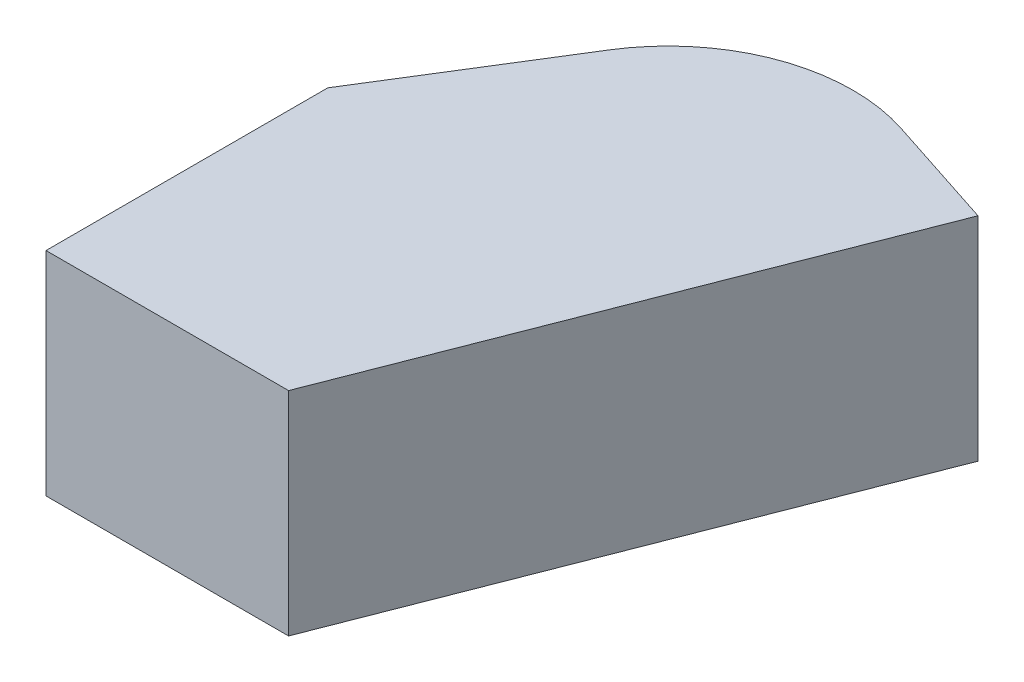
ISO-10303-21;
HEADER;
FILE_DESCRIPTION(('STEP AP214'),'2;1');
FILE_NAME('part.step','',(''),(''),'','','');
FILE_SCHEMA(('AUTOMOTIVE_DESIGN { 1 0 10303 214 1 1 1 1 }'));
ENDSEC;
DATA;
#1=APPLICATION_CONTEXT('core data for automotive mechanical design processes');
#2=APPLICATION_PROTOCOL_DEFINITION('international standard','automotive_design',2000,#1);
#3=PRODUCT_CONTEXT('',#1,'mechanical');
#4=PRODUCT('Part','Part','',(#3));
#5=PRODUCT_RELATED_PRODUCT_CATEGORY('part','',(#4));
#6=PRODUCT_DEFINITION_FORMATION('','',#4);
#7=PRODUCT_DEFINITION_CONTEXT('part definition',#1,'design');
#8=PRODUCT_DEFINITION('design','',#6,#7);
#9=PRODUCT_DEFINITION_SHAPE('','',#8);
#10=(LENGTH_UNIT() NAMED_UNIT(*) SI_UNIT(.MILLI.,.METRE.));
#11=(NAMED_UNIT(*) PLANE_ANGLE_UNIT() SI_UNIT($,.RADIAN.));
#12=(NAMED_UNIT(*) SI_UNIT($,.STERADIAN.) SOLID_ANGLE_UNIT());
#13=UNCERTAINTY_MEASURE_WITH_UNIT(LENGTH_MEASURE(1.E-05),#10,'distance_accuracy_value','');
#14=(GEOMETRIC_REPRESENTATION_CONTEXT(3) GLOBAL_UNCERTAINTY_ASSIGNED_CONTEXT((#13)) GLOBAL_UNIT_ASSIGNED_CONTEXT((#10,
#11,#12)) REPRESENTATION_CONTEXT('',''));
#15=CARTESIAN_POINT('',(0.,0.,0.));
#16=DIRECTION('',(0.,0.,1.));
#17=DIRECTION('',(1.,0.,0.));
#18=AXIS2_PLACEMENT_3D('',#15,#16,#17);
#19=CARTESIAN_POINT('',(-66.6737685117542,58.42,0.));
#20=DIRECTION('',(1.,0.,0.));
#21=DIRECTION('',(0.,0.,-1.));
#22=AXIS2_PLACEMENT_3D('',#19,#20,#21);
#23=PLANE('',#22);
#24=DIRECTION('',(0.,0.,1.));
#25=VECTOR('',#24,1.);
#26=CARTESIAN_POINT('',(-66.6737685117542,0.,0.));
#27=LINE('',#26,#25);
#28=CARTESIAN_POINT('',(-66.6737685117542,0.,0.));
#29=VERTEX_POINT('',#28);
#30=CARTESIAN_POINT('',(-66.6737685117542,0.,77.4518589102709));
#31=VERTEX_POINT('',#30);
#32=EDGE_CURVE('E117',#29,#31,#27,.T.);
#33=ORIENTED_EDGE('',*,*,#32,.T.);
#34=DIRECTION('',(0.,-1.,0.));
#35=VECTOR('',#34,1.);
#36=CARTESIAN_POINT('',(-66.6737685117542,58.42,77.4518589102709));
#37=LINE('',#36,#35);
#38=CARTESIAN_POINT('',(-66.6737685117542,58.42,77.4518589102709));
#39=VERTEX_POINT('',#38);
#40=EDGE_CURVE('E11',#39,#31,#37,.T.);
#41=ORIENTED_EDGE('',*,*,#40,.F.);
#42=DIRECTION('',(0.,0.,1.));
#43=VECTOR('',#42,1.);
#44=CARTESIAN_POINT('',(-66.6737685117542,58.42,0.));
#45=LINE('',#44,#43);
#46=CARTESIAN_POINT('',(-66.6737685117542,58.42,0.));
#47=VERTEX_POINT('',#46);
#48=EDGE_CURVE('E127',#47,#39,#45,.T.);
#49=ORIENTED_EDGE('',*,*,#48,.F.);
#50=DIRECTION('',(0.,-1.,0.));
#51=VECTOR('',#50,1.);
#52=CARTESIAN_POINT('',(-66.6737685117542,58.42,0.));
#53=LINE('',#52,#51);
#54=EDGE_CURVE('E113',#47,#29,#53,.T.);
#55=ORIENTED_EDGE('',*,*,#54,.T.);
#56=EDGE_LOOP('',(#33,#41,#49,#55));
#57=FACE_BOUND('',#56,.T.);
#58=ADVANCED_FACE('F33',(#57),#23,.F.);
#59=CARTESIAN_POINT('',(0.,58.42,77.4518589102709));
#60=DIRECTION('',(0.,0.,-1.));
#61=DIRECTION('',(-1.,0.,0.));
#62=AXIS2_PLACEMENT_3D('',#59,#60,#61);
#63=PLANE('',#62);
#64=DIRECTION('',(1.,0.,0.));
#65=VECTOR('',#64,1.);
#66=CARTESIAN_POINT('',(0.,0.,77.4518589102709));
#67=LINE('',#66,#65);
#68=CARTESIAN_POINT('',(0.,0.,77.4518589102709));
#69=VERTEX_POINT('',#68);
#70=EDGE_CURVE('E120',#31,#69,#67,.T.);
#71=ORIENTED_EDGE('',*,*,#70,.T.);
#72=DIRECTION('',(0.,-1.,0.));
#73=VECTOR('',#72,1.);
#74=CARTESIAN_POINT('',(0.,58.42,77.4518589102709));
#75=LINE('',#74,#73);
#76=CARTESIAN_POINT('',(0.,58.42,77.4518589102709));
#77=VERTEX_POINT('',#76);
#78=EDGE_CURVE('E41',#77,#69,#75,.T.);
#79=ORIENTED_EDGE('',*,*,#78,.F.);
#80=DIRECTION('',(1.,0.,0.));
#81=VECTOR('',#80,1.);
#82=CARTESIAN_POINT('',(0.,58.42,77.4518589102709));
#83=LINE('',#82,#81);
#84=EDGE_CURVE('E86',#39,#77,#83,.T.);
#85=ORIENTED_EDGE('',*,*,#84,.F.);
#86=ORIENTED_EDGE('',*,*,#40,.T.);
#87=EDGE_LOOP('',(#71,#79,#85,#86));
#88=FACE_BOUND('',#87,.T.);
#89=ADVANCED_FACE('F151',(#88),#63,.F.);
#90=CARTESIAN_POINT('',(53.1384921973379,58.42,-58.9035172942189));
#91=DIRECTION('',(-0.93174729177176,0.,-0.363107400469877));
#92=DIRECTION('',(-0.363107400469877,0.,0.93174729177176));
#93=AXIS2_PLACEMENT_3D('',#90,#91,#92);
#94=PLANE('',#93);
#95=DIRECTION('',(0.363107400469877,0.,-0.93174729177176));
#96=VECTOR('',#95,1.);
#97=CARTESIAN_POINT('',(53.1384921973379,0.,-58.9035172942189));
#98=LINE('',#97,#96);
#99=CARTESIAN_POINT('',(53.1384921973379,0.,-58.9035172942189));
#100=VERTEX_POINT('',#99);
#101=EDGE_CURVE('E122',#69,#100,#98,.T.);
#102=ORIENTED_EDGE('',*,*,#101,.T.);
#103=DIRECTION('',(0.,-1.,0.));
#104=VECTOR('',#103,1.);
#105=CARTESIAN_POINT('',(53.1384921973379,58.42,-58.9035172942189));
#106=LINE('',#105,#104);
#107=CARTESIAN_POINT('',(53.1384921973379,58.42,-58.9035172942189));
#108=VERTEX_POINT('',#107);
#109=EDGE_CURVE('E108',#108,#100,#106,.T.);
#110=ORIENTED_EDGE('',*,*,#109,.F.);
#111=DIRECTION('',(0.363107400469877,0.,-0.93174729177176));
#112=VECTOR('',#111,1.);
#113=CARTESIAN_POINT('',(53.1384921973379,58.42,-58.9035172942189));
#114=LINE('',#113,#112);
#115=EDGE_CURVE('E99',#77,#108,#114,.T.);
#116=ORIENTED_EDGE('',*,*,#115,.F.);
#117=ORIENTED_EDGE('',*,*,#78,.T.);
#118=EDGE_LOOP('',(#102,#110,#116,#117));
#119=FACE_BOUND('',#118,.T.);
#120=ADVANCED_FACE('F133',(#119),#94,.F.);
#121=CARTESIAN_POINT('',(21.8265277700403,58.42,-69.1139404770334));
#122=DIRECTION('',(-0.310020599830917,0.,0.950729839481479));
#123=DIRECTION('',(0.950729839481479,0.,0.310020599830917));
#124=AXIS2_PLACEMENT_3D('',#121,#122,#123);
#125=PLANE('',#124);
#126=DIRECTION('',(-0.950729839481479,0.,-0.310020599830917));
#127=VECTOR('',#126,1.);
#128=CARTESIAN_POINT('',(21.8265277700403,0.,-69.1139404770334));
#129=LINE('',#128,#127);
#130=CARTESIAN_POINT('',(21.8265277700403,0.,-69.1139404770334));
#131=VERTEX_POINT('',#130);
#132=EDGE_CURVE('E107',#100,#131,#129,.T.);
#133=ORIENTED_EDGE('',*,*,#132,.T.);
#134=DIRECTION('',(0.,-1.,0.));
#135=VECTOR('',#134,1.);
#136=CARTESIAN_POINT('',(21.8265277700403,58.42,-69.1139404770334));
#137=LINE('',#136,#135);
#138=CARTESIAN_POINT('',(21.8265277700403,58.42,-69.1139404770334));
#139=VERTEX_POINT('',#138);
#140=EDGE_CURVE('E104',#139,#131,#137,.T.);
#141=ORIENTED_EDGE('',*,*,#140,.F.);
#142=DIRECTION('',(-0.950729839481479,0.,-0.310020599830917));
#143=VECTOR('',#142,1.);
#144=CARTESIAN_POINT('',(21.8265277700403,58.42,-69.1139404770334));
#145=LINE('',#144,#143);
#146=EDGE_CURVE('E93',#108,#139,#145,.T.);
#147=ORIENTED_EDGE('',*,*,#146,.F.);
#148=ORIENTED_EDGE('',*,*,#109,.T.);
#149=EDGE_LOOP('',(#133,#141,#147,#148));
#150=FACE_BOUND('',#149,.T.);
#151=ADVANCED_FACE('F105',(#150),#125,.F.);
#152=CARTESIAN_POINT('',(6.07748129862949,58.42,-20.8168646313743));
#153=DIRECTION('',(0.,-1.,0.));
#154=DIRECTION('',(0.,0.,-1.));
#155=AXIS2_PLACEMENT_3D('',#152,#153,#154);
#156=CYLINDRICAL_SURFACE('',#155,50.8);
#157=CARTESIAN_POINT('',(6.07748129862949,0.,-20.8168646313743));
#158=DIRECTION('',(0.,1.,0.));
#159=DIRECTION('',(0.,0.,-1.));
#160=AXIS2_PLACEMENT_3D('',#157,#158,#159);
#161=CIRCLE('',#160,50.8);
#162=CARTESIAN_POINT('',(-37.0678218733656,0.,-47.6333299875063));
#163=VERTEX_POINT('',#162);
#164=EDGE_CURVE('E72',#131,#163,#161,.T.);
#165=ORIENTED_EDGE('',*,*,#164,.T.);
#166=DIRECTION('',(0.,-1.,0.));
#167=VECTOR('',#166,1.);
#168=CARTESIAN_POINT('',(-37.0678218733656,58.42,-47.6333299875063));
#169=LINE('',#168,#167);
#170=CARTESIAN_POINT('',(-37.0678218733656,58.42,-47.6333299875063));
#171=VERTEX_POINT('',#170);
#172=EDGE_CURVE('E109',#171,#163,#169,.T.);
#173=ORIENTED_EDGE('',*,*,#172,.F.);
#174=CARTESIAN_POINT('',(6.07748129862949,58.42,-20.8168646313743));
#175=DIRECTION('',(0.,1.,0.));
#176=DIRECTION('',(0.,0.,-1.));
#177=AXIS2_PLACEMENT_3D('',#174,#175,#176);
#178=CIRCLE('',#177,50.8);
#179=EDGE_CURVE('E97',#139,#171,#178,.T.);
#180=ORIENTED_EDGE('',*,*,#179,.F.);
#181=ORIENTED_EDGE('',*,*,#140,.T.);
#182=EDGE_LOOP('',(#165,#173,#180,#181));
#183=FACE_BOUND('',#182,.T.);
#184=ADVANCED_FACE('F111',(#183),#156,.T.);
#185=CARTESIAN_POINT('',(-66.6737685117542,58.42,0.));
#186=DIRECTION('',(0.849316991574704,0.,0.527883176301816));
#187=DIRECTION('',(0.527883176301816,0.,-0.849316991574704));
#188=AXIS2_PLACEMENT_3D('',#185,#186,#187);
#189=PLANE('',#188);
#190=DIRECTION('',(-0.527883176301816,0.,0.849316991574704));
#191=VECTOR('',#190,1.);
#192=CARTESIAN_POINT('',(-66.6737685117542,0.,0.));
#193=LINE('',#192,#191);
#194=EDGE_CURVE('E78',#163,#29,#193,.T.);
#195=ORIENTED_EDGE('',*,*,#194,.T.);
#196=ORIENTED_EDGE('',*,*,#54,.F.);
#197=DIRECTION('',(-0.527883176301816,0.,0.849316991574704));
#198=VECTOR('',#197,1.);
#199=CARTESIAN_POINT('',(-66.6737685117542,58.42,0.));
#200=LINE('',#199,#198);
#201=EDGE_CURVE('E49',#171,#47,#200,.T.);
#202=ORIENTED_EDGE('',*,*,#201,.F.);
#203=ORIENTED_EDGE('',*,*,#172,.T.);
#204=EDGE_LOOP('',(#195,#196,#202,#203));
#205=FACE_BOUND('',#204,.T.);
#206=ADVANCED_FACE('F140',(#205),#189,.F.);
#207=CARTESIAN_POINT('',(6.07748129862949,58.42,-20.8168646313743));
#208=DIRECTION('',(0.,-1.,0.));
#209=DIRECTION('',(0.,0.,-1.));
#210=AXIS2_PLACEMENT_3D('',#207,#208,#209);
#211=PLANE('',#210);
#212=ORIENTED_EDGE('',*,*,#48,.T.);
#213=ORIENTED_EDGE('',*,*,#84,.T.);
#214=ORIENTED_EDGE('',*,*,#115,.T.);
#215=ORIENTED_EDGE('',*,*,#146,.T.);
#216=ORIENTED_EDGE('',*,*,#179,.T.);
#217=ORIENTED_EDGE('',*,*,#201,.T.);
#218=EDGE_LOOP('',(#212,#213,#214,#215,#216,#217));
#219=FACE_BOUND('',#218,.T.);
#220=ADVANCED_FACE('F95',(#219),#211,.F.);
#221=CARTESIAN_POINT('',(6.07748129862949,0.,-20.8168646313743));
#222=DIRECTION('',(0.,-1.,0.));
#223=DIRECTION('',(0.,0.,-1.));
#224=AXIS2_PLACEMENT_3D('',#221,#222,#223);
#225=PLANE('',#224);
#226=ORIENTED_EDGE('',*,*,#32,.F.);
#227=ORIENTED_EDGE('',*,*,#194,.F.);
#228=ORIENTED_EDGE('',*,*,#164,.F.);
#229=ORIENTED_EDGE('',*,*,#132,.F.);
#230=ORIENTED_EDGE('',*,*,#101,.F.);
#231=ORIENTED_EDGE('',*,*,#70,.F.);
#232=EDGE_LOOP('',(#226,#227,#228,#229,#230,#231));
#233=FACE_BOUND('',#232,.T.);
#234=ADVANCED_FACE('F136',(#233),#225,.T.);
#235=CLOSED_SHELL('',(#58,#89,#120,#151,#184,#206,#220,#234));
#236=MANIFOLD_SOLID_BREP('B2',#235);
#237=ADVANCED_BREP_SHAPE_REPRESENTATION('',(#18,#236),#14);
#238=SHAPE_DEFINITION_REPRESENTATION(#9,#237);
ENDSEC;
END-ISO-10303-21;
